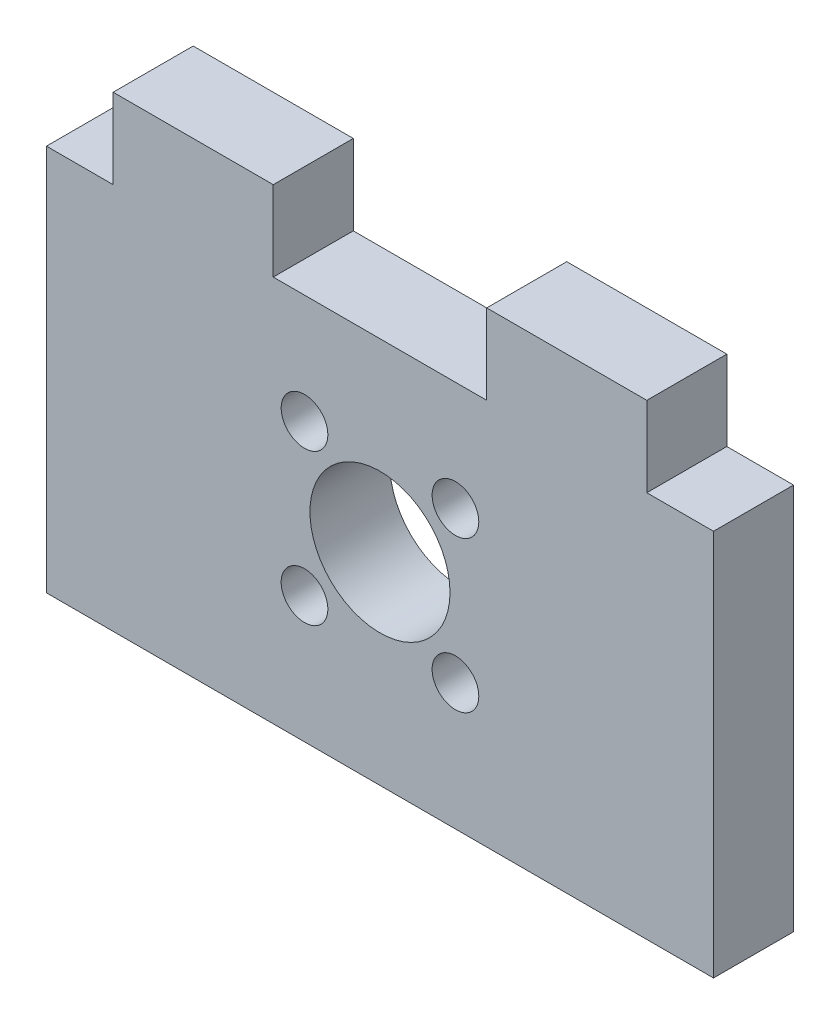
ISO-10303-21;
HEADER;
FILE_DESCRIPTION(('STEP AP214'),'2;1');
FILE_NAME('part.step','',(''),(''),'','','');
FILE_SCHEMA(('AUTOMOTIVE_DESIGN { 1 0 10303 214 1 1 1 1 }'));
ENDSEC;
DATA;
#1=APPLICATION_CONTEXT('core data for automotive mechanical design processes');
#2=APPLICATION_PROTOCOL_DEFINITION('international standard','automotive_design',2000,#1);
#3=PRODUCT_CONTEXT('',#1,'mechanical');
#4=PRODUCT('Part','Part','',(#3));
#5=PRODUCT_RELATED_PRODUCT_CATEGORY('part','',(#4));
#6=PRODUCT_DEFINITION_FORMATION('','',#4);
#7=PRODUCT_DEFINITION_CONTEXT('part definition',#1,'design');
#8=PRODUCT_DEFINITION('design','',#6,#7);
#9=PRODUCT_DEFINITION_SHAPE('','',#8);
#10=(LENGTH_UNIT() NAMED_UNIT(*) SI_UNIT(.MILLI.,.METRE.));
#11=(NAMED_UNIT(*) PLANE_ANGLE_UNIT() SI_UNIT($,.RADIAN.));
#12=(NAMED_UNIT(*) SI_UNIT($,.STERADIAN.) SOLID_ANGLE_UNIT());
#13=UNCERTAINTY_MEASURE_WITH_UNIT(LENGTH_MEASURE(1.E-05),#10,'distance_accuracy_value','');
#14=(GEOMETRIC_REPRESENTATION_CONTEXT(3) GLOBAL_UNCERTAINTY_ASSIGNED_CONTEXT((#13)) GLOBAL_UNIT_ASSIGNED_CONTEXT((#10,
#11,#12)) REPRESENTATION_CONTEXT('',''));
#15=CARTESIAN_POINT('',(0.,0.,0.));
#16=DIRECTION('',(0.,0.,1.));
#17=DIRECTION('',(1.,0.,0.));
#18=AXIS2_PLACEMENT_3D('',#15,#16,#17);
#19=CARTESIAN_POINT('',(-25.,17.5,6.));
#20=DIRECTION('',(0.,-1.,0.));
#21=DIRECTION('',(0.,0.,-1.));
#22=AXIS2_PLACEMENT_3D('',#19,#20,#21);
#23=PLANE('',#22);
#24=DIRECTION('',(-1.,0.,0.));
#25=VECTOR('',#24,1.);
#26=CARTESIAN_POINT('',(-25.,17.5,6.));
#27=LINE('',#26,#25);
#28=CARTESIAN_POINT('',(20.,17.5,6.));
#29=VERTEX_POINT('',#28);
#30=CARTESIAN_POINT('',(8.,17.5,6.));
#31=VERTEX_POINT('',#30);
#32=EDGE_CURVE('E149',#29,#31,#27,.T.);
#33=ORIENTED_EDGE('',*,*,#32,.F.);
#34=DIRECTION('',(0.,0.,1.));
#35=VECTOR('',#34,1.);
#36=CARTESIAN_POINT('',(20.,17.5,-17.0880074906351));
#37=LINE('',#36,#35);
#38=CARTESIAN_POINT('',(20.,17.5,0.));
#39=VERTEX_POINT('',#38);
#40=EDGE_CURVE('E194',#39,#29,#37,.T.);
#41=ORIENTED_EDGE('',*,*,#40,.F.);
#42=DIRECTION('',(-1.,0.,0.));
#43=VECTOR('',#42,1.);
#44=CARTESIAN_POINT('',(-25.,17.5,0.));
#45=LINE('',#44,#43);
#46=CARTESIAN_POINT('',(8.,17.5,0.));
#47=VERTEX_POINT('',#46);
#48=EDGE_CURVE('E164',#39,#47,#45,.T.);
#49=ORIENTED_EDGE('',*,*,#48,.T.);
#50=DIRECTION('',(0.,0.,1.));
#51=VECTOR('',#50,1.);
#52=CARTESIAN_POINT('',(8.,17.5,-17.0880074906351));
#53=LINE('',#52,#51);
#54=EDGE_CURVE('E202',#47,#31,#53,.T.);
#55=ORIENTED_EDGE('',*,*,#54,.T.);
#56=EDGE_LOOP('',(#33,#41,#49,#55));
#57=FACE_BOUND('',#56,.T.);
#58=ADVANCED_FACE('F33',(#57),#23,.F.);
#59=CARTESIAN_POINT('',(0.,0.,6.));
#60=DIRECTION('',(0.,0.,1.));
#61=DIRECTION('',(1.,0.,0.));
#62=AXIS2_PLACEMENT_3D('',#59,#60,#61);
#63=PLANE('',#62);
#64=DIRECTION('',(0.,1.,0.));
#65=VECTOR('',#64,1.);
#66=CARTESIAN_POINT('',(-20.,17.5,6.));
#67=LINE('',#66,#65);
#68=CARTESIAN_POINT('',(-20.,11.5,6.));
#69=VERTEX_POINT('',#68);
#70=CARTESIAN_POINT('',(-20.,17.5,6.));
#71=VERTEX_POINT('',#70);
#72=EDGE_CURVE('E136',#69,#71,#67,.T.);
#73=ORIENTED_EDGE('',*,*,#72,.F.);
#74=DIRECTION('',(1.,0.,0.));
#75=VECTOR('',#74,1.);
#76=CARTESIAN_POINT('',(-25.,11.5,6.));
#77=LINE('',#76,#75);
#78=CARTESIAN_POINT('',(-25.,11.5,6.));
#79=VERTEX_POINT('',#78);
#80=EDGE_CURVE('E128',#79,#69,#77,.T.);
#81=ORIENTED_EDGE('',*,*,#80,.F.);
#82=DIRECTION('',(0.,-1.,0.));
#83=VECTOR('',#82,1.);
#84=CARTESIAN_POINT('',(-25.,17.5,6.));
#85=LINE('',#84,#83);
#86=CARTESIAN_POINT('',(-25.,-17.5,6.));
#87=VERTEX_POINT('',#86);
#88=EDGE_CURVE('E141',#79,#87,#85,.T.);
#89=ORIENTED_EDGE('',*,*,#88,.T.);
#90=DIRECTION('',(1.,0.,0.));
#91=VECTOR('',#90,1.);
#92=CARTESIAN_POINT('',(-25.,-17.5,6.));
#93=LINE('',#92,#91);
#94=CARTESIAN_POINT('',(25.,-17.5,6.));
#95=VERTEX_POINT('',#94);
#96=EDGE_CURVE('E148',#87,#95,#93,.T.);
#97=ORIENTED_EDGE('',*,*,#96,.T.);
#98=DIRECTION('',(0.,1.,0.));
#99=VECTOR('',#98,1.);
#100=CARTESIAN_POINT('',(25.,17.5,6.));
#101=LINE('',#100,#99);
#102=CARTESIAN_POINT('',(25.,11.5,6.));
#103=VERTEX_POINT('',#102);
#104=EDGE_CURVE('E168',#95,#103,#101,.T.);
#105=ORIENTED_EDGE('',*,*,#104,.T.);
#106=DIRECTION('',(1.,0.,0.));
#107=VECTOR('',#106,1.);
#108=CARTESIAN_POINT('',(25.,11.5,6.));
#109=LINE('',#108,#107);
#110=CARTESIAN_POINT('',(20.,11.5,6.));
#111=VERTEX_POINT('',#110);
#112=EDGE_CURVE('E192',#111,#103,#109,.T.);
#113=ORIENTED_EDGE('',*,*,#112,.F.);
#114=DIRECTION('',(0.,-1.,0.));
#115=VECTOR('',#114,1.);
#116=CARTESIAN_POINT('',(20.,17.5,6.));
#117=LINE('',#116,#115);
#118=EDGE_CURVE('E189',#29,#111,#117,.T.);
#119=ORIENTED_EDGE('',*,*,#118,.F.);
#120=ORIENTED_EDGE('',*,*,#32,.T.);
#121=DIRECTION('',(0.,1.,0.));
#122=VECTOR('',#121,1.);
#123=CARTESIAN_POINT('',(8.,11.5,6.));
#124=LINE('',#123,#122);
#125=CARTESIAN_POINT('',(8.,11.5,6.));
#126=VERTEX_POINT('',#125);
#127=EDGE_CURVE('E210',#126,#31,#124,.T.);
#128=ORIENTED_EDGE('',*,*,#127,.F.);
#129=DIRECTION('',(1.,0.,0.));
#130=VECTOR('',#129,1.);
#131=CARTESIAN_POINT('',(-8.,11.5,6.));
#132=LINE('',#131,#130);
#133=CARTESIAN_POINT('',(-8.,11.5,6.));
#134=VERTEX_POINT('',#133);
#135=EDGE_CURVE('E207',#134,#126,#132,.T.);
#136=ORIENTED_EDGE('',*,*,#135,.F.);
#137=DIRECTION('',(0.,-1.,0.));
#138=VECTOR('',#137,1.);
#139=CARTESIAN_POINT('',(-8.,17.5,6.));
#140=LINE('',#139,#138);
#141=CARTESIAN_POINT('',(-8.,17.5,6.));
#142=VERTEX_POINT('',#141);
#143=EDGE_CURVE('E204',#142,#134,#140,.T.);
#144=ORIENTED_EDGE('',*,*,#143,.F.);
#145=EDGE_CURVE('E153',#142,#71,#27,.T.);
#146=ORIENTED_EDGE('',*,*,#145,.T.);
#147=EDGE_LOOP('',(#73,#81,#89,#97,#105,#113,#119,#120,#128,#136,#144,#146));
#148=FACE_BOUND('',#147,.T.);
#149=CARTESIAN_POINT('',(-5.65685424949237,-8.0068542494924,6.));
#150=DIRECTION('',(0.,0.,1.));
#151=DIRECTION('',(1.,0.,0.));
#152=AXIS2_PLACEMENT_3D('',#149,#150,#151);
#153=CIRCLE('',#152,1.75);
#154=CARTESIAN_POINT('',(-3.90685424949237,-8.0068542494924,6.));
#155=VERTEX_POINT('',#154);
#156=EDGE_CURVE('E228',#155,#155,#153,.T.);
#157=ORIENTED_EDGE('',*,*,#156,.F.);
#158=EDGE_LOOP('',(#157));
#159=FACE_BOUND('',#158,.T.);
#160=CARTESIAN_POINT('',(-5.65685424949237,3.30685424949239,6.));
#161=DIRECTION('',(0.,0.,1.));
#162=DIRECTION('',(1.,0.,0.));
#163=AXIS2_PLACEMENT_3D('',#160,#161,#162);
#164=CIRCLE('',#163,1.75);
#165=CARTESIAN_POINT('',(-3.90685424949237,3.30685424949239,6.));
#166=VERTEX_POINT('',#165);
#167=EDGE_CURVE('E240',#166,#166,#164,.T.);
#168=ORIENTED_EDGE('',*,*,#167,.F.);
#169=EDGE_LOOP('',(#168));
#170=FACE_BOUND('',#169,.T.);
#171=CARTESIAN_POINT('',(0.,-2.35,6.));
#172=DIRECTION('',(0.,0.,1.));
#173=DIRECTION('',(1.,0.,0.));
#174=AXIS2_PLACEMENT_3D('',#171,#172,#173);
#175=CIRCLE('',#174,5.25);
#176=CARTESIAN_POINT('',(5.25,-2.35,6.));
#177=VERTEX_POINT('',#176);
#178=EDGE_CURVE('E161',#177,#177,#175,.T.);
#179=ORIENTED_EDGE('',*,*,#178,.F.);
#180=EDGE_LOOP('',(#179));
#181=FACE_BOUND('',#180,.T.);
#182=CARTESIAN_POINT('',(5.65685424949237,3.30685424949239,6.));
#183=DIRECTION('',(0.,0.,1.));
#184=DIRECTION('',(1.,0.,0.));
#185=AXIS2_PLACEMENT_3D('',#182,#183,#184);
#186=CIRCLE('',#185,1.75);
#187=CARTESIAN_POINT('',(7.40685424949237,3.30685424949239,6.));
#188=VERTEX_POINT('',#187);
#189=EDGE_CURVE('E234',#188,#188,#186,.T.);
#190=ORIENTED_EDGE('',*,*,#189,.F.);
#191=EDGE_LOOP('',(#190));
#192=FACE_BOUND('',#191,.T.);
#193=CARTESIAN_POINT('',(5.65685424949237,-8.0068542494924,6.));
#194=DIRECTION('',(0.,0.,1.));
#195=DIRECTION('',(1.,0.,0.));
#196=AXIS2_PLACEMENT_3D('',#193,#194,#195);
#197=CIRCLE('',#196,1.75);
#198=CARTESIAN_POINT('',(7.40685424949237,-8.0068542494924,6.));
#199=VERTEX_POINT('',#198);
#200=EDGE_CURVE('E221',#199,#199,#197,.T.);
#201=ORIENTED_EDGE('',*,*,#200,.F.);
#202=EDGE_LOOP('',(#201));
#203=FACE_BOUND('',#202,.T.);
#204=ADVANCED_FACE('F139',(#148,#159,#170,#181,#192,#203),#63,.T.);
#205=CARTESIAN_POINT('',(0.,0.,0.));
#206=DIRECTION('',(0.,0.,1.));
#207=DIRECTION('',(1.,0.,0.));
#208=AXIS2_PLACEMENT_3D('',#205,#206,#207);
#209=PLANE('',#208);
#210=DIRECTION('',(-1.,0.,0.));
#211=VECTOR('',#210,1.);
#212=CARTESIAN_POINT('',(-25.,11.5,0.));
#213=LINE('',#212,#211);
#214=CARTESIAN_POINT('',(-20.,11.5,0.));
#215=VERTEX_POINT('',#214);
#216=CARTESIAN_POINT('',(-25.,11.5,0.));
#217=VERTEX_POINT('',#216);
#218=EDGE_CURVE('E131',#215,#217,#213,.T.);
#219=ORIENTED_EDGE('',*,*,#218,.F.);
#220=DIRECTION('',(0.,-1.,0.));
#221=VECTOR('',#220,1.);
#222=CARTESIAN_POINT('',(-20.,17.5,0.));
#223=LINE('',#222,#221);
#224=CARTESIAN_POINT('',(-20.,17.5,0.));
#225=VERTEX_POINT('',#224);
#226=EDGE_CURVE('E260',#225,#215,#223,.T.);
#227=ORIENTED_EDGE('',*,*,#226,.F.);
#228=CARTESIAN_POINT('',(-8.,17.5,0.));
#229=VERTEX_POINT('',#228);
#230=EDGE_CURVE('E160',#229,#225,#45,.T.);
#231=ORIENTED_EDGE('',*,*,#230,.F.);
#232=DIRECTION('',(0.,1.,0.));
#233=VECTOR('',#232,1.);
#234=CARTESIAN_POINT('',(-8.,17.5,0.));
#235=LINE('',#234,#233);
#236=CARTESIAN_POINT('',(-8.,11.5,0.));
#237=VERTEX_POINT('',#236);
#238=EDGE_CURVE('E48',#237,#229,#235,.T.);
#239=ORIENTED_EDGE('',*,*,#238,.F.);
#240=DIRECTION('',(-1.,0.,0.));
#241=VECTOR('',#240,1.);
#242=CARTESIAN_POINT('',(-8.,11.5,0.));
#243=LINE('',#242,#241);
#244=CARTESIAN_POINT('',(8.,11.5,0.));
#245=VERTEX_POINT('',#244);
#246=EDGE_CURVE('E199',#245,#237,#243,.T.);
#247=ORIENTED_EDGE('',*,*,#246,.F.);
#248=DIRECTION('',(0.,-1.,0.));
#249=VECTOR('',#248,1.);
#250=CARTESIAN_POINT('',(8.,11.5,0.));
#251=LINE('',#250,#249);
#252=EDGE_CURVE('E201',#47,#245,#251,.T.);
#253=ORIENTED_EDGE('',*,*,#252,.F.);
#254=ORIENTED_EDGE('',*,*,#48,.F.);
#255=DIRECTION('',(0.,1.,0.));
#256=VECTOR('',#255,1.);
#257=CARTESIAN_POINT('',(20.,17.5,0.));
#258=LINE('',#257,#256);
#259=CARTESIAN_POINT('',(20.,11.5,0.));
#260=VERTEX_POINT('',#259);
#261=EDGE_CURVE('E56',#260,#39,#258,.T.);
#262=ORIENTED_EDGE('',*,*,#261,.F.);
#263=DIRECTION('',(-1.,0.,0.));
#264=VECTOR('',#263,1.);
#265=CARTESIAN_POINT('',(25.,11.5,0.));
#266=LINE('',#265,#264);
#267=CARTESIAN_POINT('',(25.,11.5,0.));
#268=VERTEX_POINT('',#267);
#269=EDGE_CURVE('E144',#268,#260,#266,.T.);
#270=ORIENTED_EDGE('',*,*,#269,.F.);
#271=DIRECTION('',(0.,1.,0.));
#272=VECTOR('',#271,1.);
#273=CARTESIAN_POINT('',(25.,17.5,0.));
#274=LINE('',#273,#272);
#275=CARTESIAN_POINT('',(25.,-17.5,0.));
#276=VERTEX_POINT('',#275);
#277=EDGE_CURVE('E157',#276,#268,#274,.T.);
#278=ORIENTED_EDGE('',*,*,#277,.F.);
#279=DIRECTION('',(1.,0.,0.));
#280=VECTOR('',#279,1.);
#281=CARTESIAN_POINT('',(-25.,-17.5,0.));
#282=LINE('',#281,#280);
#283=CARTESIAN_POINT('',(-25.,-17.5,0.));
#284=VERTEX_POINT('',#283);
#285=EDGE_CURVE('E167',#284,#276,#282,.T.);
#286=ORIENTED_EDGE('',*,*,#285,.F.);
#287=DIRECTION('',(0.,-1.,0.));
#288=VECTOR('',#287,1.);
#289=CARTESIAN_POINT('',(-25.,17.5,0.));
#290=LINE('',#289,#288);
#291=EDGE_CURVE('E165',#217,#284,#290,.T.);
#292=ORIENTED_EDGE('',*,*,#291,.F.);
#293=EDGE_LOOP('',(#219,#227,#231,#239,#247,#253,#254,#262,#270,#278,#286,#292));
#294=FACE_BOUND('',#293,.T.);
#295=CARTESIAN_POINT('',(0.,-2.35,0.));
#296=DIRECTION('',(0.,0.,1.));
#297=DIRECTION('',(1.,0.,0.));
#298=AXIS2_PLACEMENT_3D('',#295,#296,#297);
#299=CIRCLE('',#298,5.25);
#300=CARTESIAN_POINT('',(5.25,-2.35,0.));
#301=VERTEX_POINT('',#300);
#302=EDGE_CURVE('E243',#301,#301,#299,.T.);
#303=ORIENTED_EDGE('',*,*,#302,.T.);
#304=EDGE_LOOP('',(#303));
#305=FACE_BOUND('',#304,.T.);
#306=CARTESIAN_POINT('',(-5.65685424949237,3.30685424949239,0.));
#307=DIRECTION('',(0.,0.,1.));
#308=DIRECTION('',(1.,0.,0.));
#309=AXIS2_PLACEMENT_3D('',#306,#307,#308);
#310=CIRCLE('',#309,1.75);
#311=CARTESIAN_POINT('',(-3.90685424949237,3.30685424949239,0.));
#312=VERTEX_POINT('',#311);
#313=EDGE_CURVE('E237',#312,#312,#310,.T.);
#314=ORIENTED_EDGE('',*,*,#313,.T.);
#315=EDGE_LOOP('',(#314));
#316=FACE_BOUND('',#315,.T.);
#317=CARTESIAN_POINT('',(5.65685424949237,3.30685424949239,0.));
#318=DIRECTION('',(0.,0.,1.));
#319=DIRECTION('',(1.,0.,0.));
#320=AXIS2_PLACEMENT_3D('',#317,#318,#319);
#321=CIRCLE('',#320,1.75);
#322=CARTESIAN_POINT('',(7.40685424949237,3.30685424949239,0.));
#323=VERTEX_POINT('',#322);
#324=EDGE_CURVE('E231',#323,#323,#321,.T.);
#325=ORIENTED_EDGE('',*,*,#324,.T.);
#326=EDGE_LOOP('',(#325));
#327=FACE_BOUND('',#326,.T.);
#328=CARTESIAN_POINT('',(-5.65685424949237,-8.0068542494924,0.));
#329=DIRECTION('',(0.,0.,1.));
#330=DIRECTION('',(1.,0.,0.));
#331=AXIS2_PLACEMENT_3D('',#328,#329,#330);
#332=CIRCLE('',#331,1.75);
#333=CARTESIAN_POINT('',(-3.90685424949237,-8.0068542494924,0.));
#334=VERTEX_POINT('',#333);
#335=EDGE_CURVE('E224',#334,#334,#332,.T.);
#336=ORIENTED_EDGE('',*,*,#335,.T.);
#337=EDGE_LOOP('',(#336));
#338=FACE_BOUND('',#337,.T.);
#339=CARTESIAN_POINT('',(5.65685424949237,-8.0068542494924,0.));
#340=DIRECTION('',(0.,0.,1.));
#341=DIRECTION('',(1.,0.,0.));
#342=AXIS2_PLACEMENT_3D('',#339,#340,#341);
#343=CIRCLE('',#342,1.75);
#344=CARTESIAN_POINT('',(7.40685424949237,-8.0068542494924,0.));
#345=VERTEX_POINT('',#344);
#346=EDGE_CURVE('E225',#345,#345,#343,.T.);
#347=ORIENTED_EDGE('',*,*,#346,.T.);
#348=EDGE_LOOP('',(#347));
#349=FACE_BOUND('',#348,.T.);
#350=ADVANCED_FACE('F180',(#294,#305,#316,#327,#338,#349),#209,.F.);
#351=CARTESIAN_POINT('',(25.,17.5,6.));
#352=DIRECTION('',(-1.,0.,0.));
#353=DIRECTION('',(0.,-1.,0.));
#354=AXIS2_PLACEMENT_3D('',#351,#352,#353);
#355=PLANE('',#354);
#356=ORIENTED_EDGE('',*,*,#277,.T.);
#357=DIRECTION('',(0.,0.,1.));
#358=VECTOR('',#357,1.);
#359=CARTESIAN_POINT('',(25.,11.5,-17.0880074906351));
#360=LINE('',#359,#358);
#361=EDGE_CURVE('E185',#268,#103,#360,.T.);
#362=ORIENTED_EDGE('',*,*,#361,.T.);
#363=ORIENTED_EDGE('',*,*,#104,.F.);
#364=DIRECTION('',(0.,0.,-1.));
#365=VECTOR('',#364,1.);
#366=CARTESIAN_POINT('',(25.,-17.5,6.));
#367=LINE('',#366,#365);
#368=EDGE_CURVE('E41',#95,#276,#367,.T.);
#369=ORIENTED_EDGE('',*,*,#368,.T.);
#370=EDGE_LOOP('',(#356,#362,#363,#369));
#371=FACE_BOUND('',#370,.T.);
#372=ADVANCED_FACE('F35',(#371),#355,.F.);
#373=ORIENTED_EDGE('',*,*,#230,.T.);
#374=DIRECTION('',(0.,0.,1.));
#375=VECTOR('',#374,1.);
#376=CARTESIAN_POINT('',(-20.,17.5,-17.0880074906351));
#377=LINE('',#376,#375);
#378=EDGE_CURVE('E257',#225,#71,#377,.T.);
#379=ORIENTED_EDGE('',*,*,#378,.T.);
#380=ORIENTED_EDGE('',*,*,#145,.F.);
#381=DIRECTION('',(0.,0.,1.));
#382=VECTOR('',#381,1.);
#383=CARTESIAN_POINT('',(-8.,17.5,-17.0880074906351));
#384=LINE('',#383,#382);
#385=EDGE_CURVE('E212',#229,#142,#384,.T.);
#386=ORIENTED_EDGE('',*,*,#385,.F.);
#387=EDGE_LOOP('',(#373,#379,#380,#386));
#388=FACE_BOUND('',#387,.T.);
#389=ADVANCED_FACE('F255',(#388),#23,.F.);
#390=CARTESIAN_POINT('',(-25.,17.5,6.));
#391=DIRECTION('',(1.,0.,0.));
#392=DIRECTION('',(0.,1.,0.));
#393=AXIS2_PLACEMENT_3D('',#390,#391,#392);
#394=PLANE('',#393);
#395=ORIENTED_EDGE('',*,*,#88,.F.);
#396=DIRECTION('',(0.,0.,1.));
#397=VECTOR('',#396,1.);
#398=CARTESIAN_POINT('',(-25.,11.5,-17.0880074906351));
#399=LINE('',#398,#397);
#400=EDGE_CURVE('E124',#217,#79,#399,.T.);
#401=ORIENTED_EDGE('',*,*,#400,.F.);
#402=ORIENTED_EDGE('',*,*,#291,.T.);
#403=DIRECTION('',(0.,0.,-1.));
#404=VECTOR('',#403,1.);
#405=CARTESIAN_POINT('',(-25.,-17.5,6.));
#406=LINE('',#405,#404);
#407=EDGE_CURVE('E11',#87,#284,#406,.T.);
#408=ORIENTED_EDGE('',*,*,#407,.F.);
#409=EDGE_LOOP('',(#395,#401,#402,#408));
#410=FACE_BOUND('',#409,.T.);
#411=ADVANCED_FACE('F146',(#410),#394,.F.);
#412=CARTESIAN_POINT('',(-25.,-17.5,6.));
#413=DIRECTION('',(0.,1.,0.));
#414=DIRECTION('',(0.,0.,1.));
#415=AXIS2_PLACEMENT_3D('',#412,#413,#414);
#416=PLANE('',#415);
#417=ORIENTED_EDGE('',*,*,#285,.T.);
#418=ORIENTED_EDGE('',*,*,#368,.F.);
#419=ORIENTED_EDGE('',*,*,#96,.F.);
#420=ORIENTED_EDGE('',*,*,#407,.T.);
#421=EDGE_LOOP('',(#417,#418,#419,#420));
#422=FACE_BOUND('',#421,.T.);
#423=ADVANCED_FACE('F266',(#422),#416,.F.);
#424=CARTESIAN_POINT('',(0.,-2.35,6.));
#425=DIRECTION('',(0.,0.,-1.));
#426=DIRECTION('',(-1.,0.,0.));
#427=AXIS2_PLACEMENT_3D('',#424,#425,#426);
#428=CYLINDRICAL_SURFACE('',#427,5.25);
#429=ORIENTED_EDGE('',*,*,#178,.T.);
#430=EDGE_LOOP('',(#429));
#431=FACE_BOUND('',#430,.T.);
#432=ORIENTED_EDGE('',*,*,#302,.F.);
#433=EDGE_LOOP('',(#432));
#434=FACE_BOUND('',#433,.T.);
#435=ADVANCED_FACE('F268',(#431,#434),#428,.F.);
#436=CARTESIAN_POINT('',(-5.65685424949237,3.30685424949239,6.));
#437=DIRECTION('',(0.,0.,-1.));
#438=DIRECTION('',(-1.,0.,0.));
#439=AXIS2_PLACEMENT_3D('',#436,#437,#438);
#440=CYLINDRICAL_SURFACE('',#439,1.75);
#441=ORIENTED_EDGE('',*,*,#167,.T.);
#442=EDGE_LOOP('',(#441));
#443=FACE_BOUND('',#442,.T.);
#444=ORIENTED_EDGE('',*,*,#313,.F.);
#445=EDGE_LOOP('',(#444));
#446=FACE_BOUND('',#445,.T.);
#447=ADVANCED_FACE('F274',(#443,#446),#440,.F.);
#448=CARTESIAN_POINT('',(5.65685424949237,3.30685424949239,6.));
#449=DIRECTION('',(0.,0.,-1.));
#450=DIRECTION('',(-1.,0.,0.));
#451=AXIS2_PLACEMENT_3D('',#448,#449,#450);
#452=CYLINDRICAL_SURFACE('',#451,1.75);
#453=ORIENTED_EDGE('',*,*,#189,.T.);
#454=EDGE_LOOP('',(#453));
#455=FACE_BOUND('',#454,.T.);
#456=ORIENTED_EDGE('',*,*,#324,.F.);
#457=EDGE_LOOP('',(#456));
#458=FACE_BOUND('',#457,.T.);
#459=ADVANCED_FACE('F298',(#455,#458),#452,.F.);
#460=CARTESIAN_POINT('',(-5.65685424949237,-8.0068542494924,6.));
#461=DIRECTION('',(0.,0.,-1.));
#462=DIRECTION('',(-1.,0.,0.));
#463=AXIS2_PLACEMENT_3D('',#460,#461,#462);
#464=CYLINDRICAL_SURFACE('',#463,1.75);
#465=ORIENTED_EDGE('',*,*,#156,.T.);
#466=EDGE_LOOP('',(#465));
#467=FACE_BOUND('',#466,.T.);
#468=ORIENTED_EDGE('',*,*,#335,.F.);
#469=EDGE_LOOP('',(#468));
#470=FACE_BOUND('',#469,.T.);
#471=ADVANCED_FACE('F302',(#467,#470),#464,.F.);
#472=CARTESIAN_POINT('',(5.65685424949237,-8.0068542494924,6.));
#473=DIRECTION('',(0.,0.,-1.));
#474=DIRECTION('',(-1.,0.,0.));
#475=AXIS2_PLACEMENT_3D('',#472,#473,#474);
#476=CYLINDRICAL_SURFACE('',#475,1.75);
#477=ORIENTED_EDGE('',*,*,#200,.T.);
#478=EDGE_LOOP('',(#477));
#479=FACE_BOUND('',#478,.T.);
#480=ORIENTED_EDGE('',*,*,#346,.F.);
#481=EDGE_LOOP('',(#480));
#482=FACE_BOUND('',#481,.T.);
#483=ADVANCED_FACE('F306',(#479,#482),#476,.F.);
#484=CARTESIAN_POINT('',(-20.,17.5,-17.0880074906351));
#485=DIRECTION('',(1.,0.,0.));
#486=DIRECTION('',(0.,1.,0.));
#487=AXIS2_PLACEMENT_3D('',#484,#485,#486);
#488=PLANE('',#487);
#489=ORIENTED_EDGE('',*,*,#226,.T.);
#490=DIRECTION('',(0.,0.,1.));
#491=VECTOR('',#490,1.);
#492=CARTESIAN_POINT('',(-20.,11.5,-17.0880074906351));
#493=LINE('',#492,#491);
#494=EDGE_CURVE('E135',#215,#69,#493,.T.);
#495=ORIENTED_EDGE('',*,*,#494,.T.);
#496=ORIENTED_EDGE('',*,*,#72,.T.);
#497=ORIENTED_EDGE('',*,*,#378,.F.);
#498=EDGE_LOOP('',(#489,#495,#496,#497));
#499=FACE_BOUND('',#498,.T.);
#500=ADVANCED_FACE('F265',(#499),#488,.F.);
#501=CARTESIAN_POINT('',(-25.,11.5,-17.0880074906351));
#502=DIRECTION('',(0.,-1.,0.));
#503=DIRECTION('',(1.,0.,0.));
#504=AXIS2_PLACEMENT_3D('',#501,#502,#503);
#505=PLANE('',#504);
#506=ORIENTED_EDGE('',*,*,#218,.T.);
#507=ORIENTED_EDGE('',*,*,#400,.T.);
#508=ORIENTED_EDGE('',*,*,#80,.T.);
#509=ORIENTED_EDGE('',*,*,#494,.F.);
#510=EDGE_LOOP('',(#506,#507,#508,#509));
#511=FACE_BOUND('',#510,.T.);
#512=ADVANCED_FACE('F126',(#511),#505,.F.);
#513=CARTESIAN_POINT('',(8.,11.5,-17.0880074906351));
#514=DIRECTION('',(1.,0.,0.));
#515=DIRECTION('',(0.,0.,-1.));
#516=AXIS2_PLACEMENT_3D('',#513,#514,#515);
#517=PLANE('',#516);
#518=ORIENTED_EDGE('',*,*,#252,.T.);
#519=DIRECTION('',(0.,0.,1.));
#520=VECTOR('',#519,1.);
#521=CARTESIAN_POINT('',(8.,11.5,-17.0880074906351));
#522=LINE('',#521,#520);
#523=EDGE_CURVE('E215',#245,#126,#522,.T.);
#524=ORIENTED_EDGE('',*,*,#523,.T.);
#525=ORIENTED_EDGE('',*,*,#127,.T.);
#526=ORIENTED_EDGE('',*,*,#54,.F.);
#527=EDGE_LOOP('',(#518,#524,#525,#526));
#528=FACE_BOUND('',#527,.T.);
#529=ADVANCED_FACE('F318',(#528),#517,.F.);
#530=CARTESIAN_POINT('',(-8.,11.5,-17.0880074906351));
#531=DIRECTION('',(0.,-1.,0.));
#532=DIRECTION('',(0.,0.,-1.));
#533=AXIS2_PLACEMENT_3D('',#530,#531,#532);
#534=PLANE('',#533);
#535=ORIENTED_EDGE('',*,*,#246,.T.);
#536=DIRECTION('',(0.,0.,1.));
#537=VECTOR('',#536,1.);
#538=CARTESIAN_POINT('',(-8.,11.5,-17.0880074906351));
#539=LINE('',#538,#537);
#540=EDGE_CURVE('E217',#237,#134,#539,.T.);
#541=ORIENTED_EDGE('',*,*,#540,.T.);
#542=ORIENTED_EDGE('',*,*,#135,.T.);
#543=ORIENTED_EDGE('',*,*,#523,.F.);
#544=EDGE_LOOP('',(#535,#541,#542,#543));
#545=FACE_BOUND('',#544,.T.);
#546=ADVANCED_FACE('F315',(#545),#534,.F.);
#547=CARTESIAN_POINT('',(-8.,17.5,-17.0880074906351));
#548=DIRECTION('',(-1.,0.,0.));
#549=DIRECTION('',(0.,0.,1.));
#550=AXIS2_PLACEMENT_3D('',#547,#548,#549);
#551=PLANE('',#550);
#552=ORIENTED_EDGE('',*,*,#238,.T.);
#553=ORIENTED_EDGE('',*,*,#385,.T.);
#554=ORIENTED_EDGE('',*,*,#143,.T.);
#555=ORIENTED_EDGE('',*,*,#540,.F.);
#556=EDGE_LOOP('',(#552,#553,#554,#555));
#557=FACE_BOUND('',#556,.T.);
#558=ADVANCED_FACE('F311',(#557),#551,.F.);
#559=CARTESIAN_POINT('',(25.,11.5,-17.0880074906351));
#560=DIRECTION('',(0.,-1.,0.));
#561=DIRECTION('',(1.,0.,0.));
#562=AXIS2_PLACEMENT_3D('',#559,#560,#561);
#563=PLANE('',#562);
#564=ORIENTED_EDGE('',*,*,#269,.T.);
#565=DIRECTION('',(0.,0.,1.));
#566=VECTOR('',#565,1.);
#567=CARTESIAN_POINT('',(20.,11.5,-17.0880074906351));
#568=LINE('',#567,#566);
#569=EDGE_CURVE('E196',#260,#111,#568,.T.);
#570=ORIENTED_EDGE('',*,*,#569,.T.);
#571=ORIENTED_EDGE('',*,*,#112,.T.);
#572=ORIENTED_EDGE('',*,*,#361,.F.);
#573=EDGE_LOOP('',(#564,#570,#571,#572));
#574=FACE_BOUND('',#573,.T.);
#575=ADVANCED_FACE('F314',(#574),#563,.F.);
#576=CARTESIAN_POINT('',(20.,17.5,-17.0880074906351));
#577=DIRECTION('',(-1.,0.,0.));
#578=DIRECTION('',(0.,-1.,0.));
#579=AXIS2_PLACEMENT_3D('',#576,#577,#578);
#580=PLANE('',#579);
#581=ORIENTED_EDGE('',*,*,#261,.T.);
#582=ORIENTED_EDGE('',*,*,#40,.T.);
#583=ORIENTED_EDGE('',*,*,#118,.T.);
#584=ORIENTED_EDGE('',*,*,#569,.F.);
#585=EDGE_LOOP('',(#581,#582,#583,#584));
#586=FACE_BOUND('',#585,.T.);
#587=ADVANCED_FACE('F323',(#586),#580,.F.);
#588=CLOSED_SHELL('',(#58,#204,#350,#372,#389,#411,#423,#435,#447,#459,#471,#483,#500,#512,#529,
#546,#558,#575,#587));
#589=MANIFOLD_SOLID_BREP('B2',#588);
#590=ADVANCED_BREP_SHAPE_REPRESENTATION('',(#18,#589),#14);
#591=SHAPE_DEFINITION_REPRESENTATION(#9,#590);
ENDSEC;
END-ISO-10303-21;
